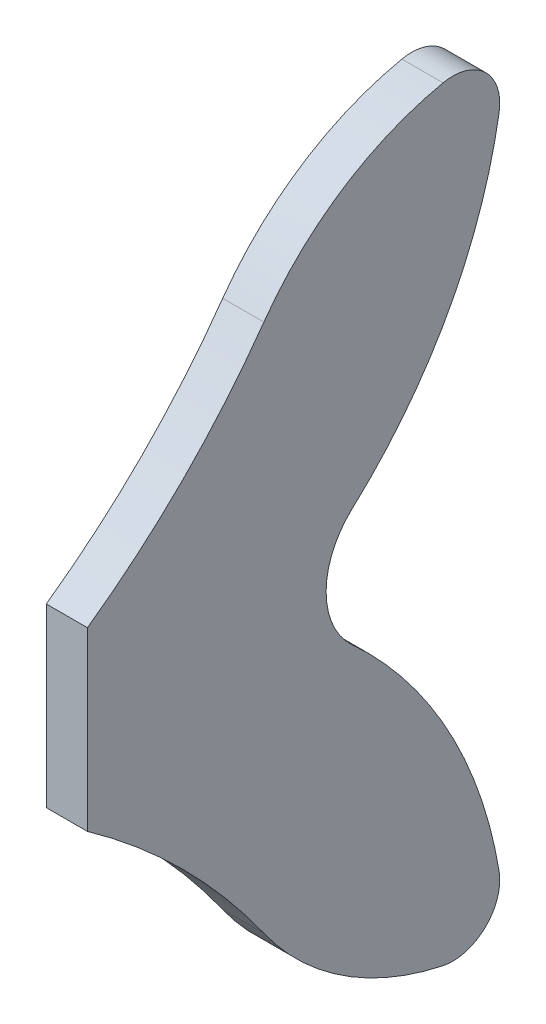
ISO-10303-21;
HEADER;
FILE_DESCRIPTION(('STEP AP214'),'2;1');
FILE_NAME('part.step','',(''),(''),'','','');
FILE_SCHEMA(('AUTOMOTIVE_DESIGN { 1 0 10303 214 1 1 1 1 }'));
ENDSEC;
DATA;
#1=APPLICATION_CONTEXT('core data for automotive mechanical design processes');
#2=APPLICATION_PROTOCOL_DEFINITION('international standard','automotive_design',2000,#1);
#3=PRODUCT_CONTEXT('',#1,'mechanical');
#4=PRODUCT('Part','Part','',(#3));
#5=PRODUCT_RELATED_PRODUCT_CATEGORY('part','',(#4));
#6=PRODUCT_DEFINITION_FORMATION('','',#4);
#7=PRODUCT_DEFINITION_CONTEXT('part definition',#1,'design');
#8=PRODUCT_DEFINITION('design','',#6,#7);
#9=PRODUCT_DEFINITION_SHAPE('','',#8);
#10=(LENGTH_UNIT() NAMED_UNIT(*) SI_UNIT(.MILLI.,.METRE.));
#11=(NAMED_UNIT(*) PLANE_ANGLE_UNIT() SI_UNIT($,.RADIAN.));
#12=(NAMED_UNIT(*) SI_UNIT($,.STERADIAN.) SOLID_ANGLE_UNIT());
#13=UNCERTAINTY_MEASURE_WITH_UNIT(LENGTH_MEASURE(1.E-05),#10,'distance_accuracy_value','');
#14=(GEOMETRIC_REPRESENTATION_CONTEXT(3) GLOBAL_UNCERTAINTY_ASSIGNED_CONTEXT((#13)) GLOBAL_UNIT_ASSIGNED_CONTEXT((#10,
#11,#12)) REPRESENTATION_CONTEXT('',''));
#15=CARTESIAN_POINT('',(0.,0.,0.));
#16=DIRECTION('',(0.,0.,1.));
#17=DIRECTION('',(1.,0.,0.));
#18=AXIS2_PLACEMENT_3D('',#15,#16,#17);
#19=CARTESIAN_POINT('',(3.5,118.128693685528,73.1286936855277));
#20=DIRECTION('',(-1.,0.,0.));
#21=DIRECTION('',(0.,0.,1.));
#22=AXIS2_PLACEMENT_3D('',#19,#20,#21);
#23=CYLINDRICAL_SURFACE('',#22,126.425208330598);
#24=CARTESIAN_POINT('',(-3.5,118.128693685528,73.1286936855277));
#25=DIRECTION('',(-1.,0.,0.));
#26=DIRECTION('',(0.,0.,-1.));
#27=AXIS2_PLACEMENT_3D('',#24,#25,#26);
#28=CIRCLE('',#27,126.425208330598);
#29=CARTESIAN_POINT('',(-3.5,45.,-30.));
#30=VERTEX_POINT('',#29);
#31=CARTESIAN_POINT('',(-3.5,15.,0.));
#32=VERTEX_POINT('',#31);
#33=EDGE_CURVE('E141',#30,#32,#28,.T.);
#34=ORIENTED_EDGE('',*,*,#33,.T.);
#35=DIRECTION('',(-1.,0.,0.));
#36=VECTOR('',#35,1.);
#37=CARTESIAN_POINT('',(3.5,15.,0.));
#38=LINE('',#37,#36);
#39=CARTESIAN_POINT('',(3.5,15.,0.));
#40=VERTEX_POINT('',#39);
#41=EDGE_CURVE('E11',#40,#32,#38,.T.);
#42=ORIENTED_EDGE('',*,*,#41,.F.);
#43=CARTESIAN_POINT('',(3.5,118.128693685528,73.1286936855277));
#44=DIRECTION('',(-1.,0.,0.));
#45=DIRECTION('',(0.,0.,-1.));
#46=AXIS2_PLACEMENT_3D('',#43,#44,#45);
#47=CIRCLE('',#46,126.425208330598);
#48=CARTESIAN_POINT('',(3.5,45.,-30.));
#49=VERTEX_POINT('',#48);
#50=EDGE_CURVE('E159',#49,#40,#47,.T.);
#51=ORIENTED_EDGE('',*,*,#50,.F.);
#52=DIRECTION('',(-1.,0.,0.));
#53=VECTOR('',#52,1.);
#54=CARTESIAN_POINT('',(3.5,45.,-30.));
#55=LINE('',#54,#53);
#56=EDGE_CURVE('E137',#49,#30,#55,.T.);
#57=ORIENTED_EDGE('',*,*,#56,.T.);
#58=EDGE_LOOP('',(#34,#42,#51,#57));
#59=FACE_BOUND('',#58,.T.);
#60=ADVANCED_FACE('F33',(#59),#23,.F.);
#61=CARTESIAN_POINT('',(3.5,15.,0.));
#62=DIRECTION('',(0.,0.,-1.));
#63=DIRECTION('',(-1.,0.,0.));
#64=AXIS2_PLACEMENT_3D('',#61,#62,#63);
#65=PLANE('',#64);
#66=DIRECTION('',(0.,-1.,0.));
#67=VECTOR('',#66,1.);
#68=CARTESIAN_POINT('',(-3.5,15.,0.));
#69=LINE('',#68,#67);
#70=CARTESIAN_POINT('',(-3.5,-15.,0.));
#71=VERTEX_POINT('',#70);
#72=EDGE_CURVE('E144',#32,#71,#69,.T.);
#73=ORIENTED_EDGE('',*,*,#72,.T.);
#74=DIRECTION('',(-1.,0.,0.));
#75=VECTOR('',#74,1.);
#76=CARTESIAN_POINT('',(3.5,-15.,0.));
#77=LINE('',#76,#75);
#78=CARTESIAN_POINT('',(3.5,-15.,0.));
#79=VERTEX_POINT('',#78);
#80=EDGE_CURVE('E41',#79,#71,#77,.T.);
#81=ORIENTED_EDGE('',*,*,#80,.F.);
#82=DIRECTION('',(0.,-1.,0.));
#83=VECTOR('',#82,1.);
#84=CARTESIAN_POINT('',(3.5,15.,0.));
#85=LINE('',#84,#83);
#86=EDGE_CURVE('E98',#40,#79,#85,.T.);
#87=ORIENTED_EDGE('',*,*,#86,.F.);
#88=ORIENTED_EDGE('',*,*,#41,.T.);
#89=EDGE_LOOP('',(#73,#81,#87,#88));
#90=FACE_BOUND('',#89,.T.);
#91=ADVANCED_FACE('F208',(#90),#65,.F.);
#92=CARTESIAN_POINT('',(3.5,-118.128693685528,73.1286936855277));
#93=DIRECTION('',(-1.,0.,0.));
#94=DIRECTION('',(0.,0.,1.));
#95=AXIS2_PLACEMENT_3D('',#92,#93,#94);
#96=CYLINDRICAL_SURFACE('',#95,126.425208330598);
#97=CARTESIAN_POINT('',(-3.5,-118.128693685528,73.1286936855277));
#98=DIRECTION('',(-1.,0.,0.));
#99=DIRECTION('',(0.,0.,1.));
#100=AXIS2_PLACEMENT_3D('',#97,#98,#99);
#101=CIRCLE('',#100,126.425208330598);
#102=CARTESIAN_POINT('',(-3.5,-45.,-30.));
#103=VERTEX_POINT('',#102);
#104=EDGE_CURVE('E146',#71,#103,#101,.T.);
#105=ORIENTED_EDGE('',*,*,#104,.T.);
#106=DIRECTION('',(-1.,0.,0.));
#107=VECTOR('',#106,1.);
#108=CARTESIAN_POINT('',(3.5,-45.,-30.));
#109=LINE('',#108,#107);
#110=CARTESIAN_POINT('',(3.5,-45.,-30.));
#111=VERTEX_POINT('',#110);
#112=EDGE_CURVE('E172',#111,#103,#109,.T.);
#113=ORIENTED_EDGE('',*,*,#112,.F.);
#114=CARTESIAN_POINT('',(3.5,-118.128693685528,73.1286936855277));
#115=DIRECTION('',(-1.,0.,0.));
#116=DIRECTION('',(0.,0.,1.));
#117=AXIS2_PLACEMENT_3D('',#114,#115,#116);
#118=CIRCLE('',#117,126.425208330598);
#119=EDGE_CURVE('E180',#79,#111,#118,.T.);
#120=ORIENTED_EDGE('',*,*,#119,.F.);
#121=ORIENTED_EDGE('',*,*,#80,.T.);
#122=EDGE_LOOP('',(#105,#113,#120,#121));
#123=FACE_BOUND('',#122,.T.);
#124=ADVANCED_FACE('F178',(#123),#96,.F.);
#125=CARTESIAN_POINT('',(3.5,-16.078278354781,-70.78644403569));
#126=DIRECTION('',(-1.,0.,0.));
#127=DIRECTION('',(0.,0.,1.));
#128=AXIS2_PLACEMENT_3D('',#125,#126,#127);
#129=CYLINDRICAL_SURFACE('',#128,50.);
#130=CARTESIAN_POINT('',(-3.5,-16.078278354781,-70.78644403569));
#131=DIRECTION('',(1.,0.,0.));
#132=DIRECTION('',(0.,0.,-1.));
#133=AXIS2_PLACEMENT_3D('',#130,#131,#132);
#134=CIRCLE('',#133,50.);
#135=CARTESIAN_POINT('',(-3.5,-65.,-60.4585618100006));
#136=VERTEX_POINT('',#135);
#137=EDGE_CURVE('E148',#103,#136,#134,.T.);
#138=ORIENTED_EDGE('',*,*,#137,.T.);
#139=DIRECTION('',(-1.,0.,0.));
#140=VECTOR('',#139,1.);
#141=CARTESIAN_POINT('',(3.5,-65.,-60.4585618100006));
#142=LINE('',#141,#140);
#143=CARTESIAN_POINT('',(3.5,-65.,-60.4585618100006));
#144=VERTEX_POINT('',#143);
#145=EDGE_CURVE('E169',#144,#136,#142,.T.);
#146=ORIENTED_EDGE('',*,*,#145,.F.);
#147=CARTESIAN_POINT('',(3.5,-16.078278354781,-70.78644403569));
#148=DIRECTION('',(1.,0.,0.));
#149=DIRECTION('',(0.,0.,-1.));
#150=AXIS2_PLACEMENT_3D('',#147,#148,#149);
#151=CIRCLE('',#150,50.);
#152=EDGE_CURVE('E198',#111,#144,#151,.T.);
#153=ORIENTED_EDGE('',*,*,#152,.F.);
#154=ORIENTED_EDGE('',*,*,#112,.T.);
#155=EDGE_LOOP('',(#138,#146,#153,#154));
#156=FACE_BOUND('',#155,.T.);
#157=ADVANCED_FACE('F189',(#156),#129,.T.);
#158=CARTESIAN_POINT('',(3.5,-57.172524536765,-62.1110229661109));
#159=DIRECTION('',(-1.,0.,0.));
#160=DIRECTION('',(0.,0.,1.));
#161=AXIS2_PLACEMENT_3D('',#158,#159,#160);
#162=CYLINDRICAL_SURFACE('',#161,8.);
#163=CARTESIAN_POINT('',(-3.5,-57.172524536765,-62.1110229661109));
#164=DIRECTION('',(1.,0.,0.));
#165=DIRECTION('',(0.,0.,-1.));
#166=AXIS2_PLACEMENT_3D('',#163,#164,#165);
#167=CIRCLE('',#166,8.);
#168=CARTESIAN_POINT('',(-3.5,-55.8443523495954,-70.));
#169=VERTEX_POINT('',#168);
#170=EDGE_CURVE('E150',#136,#169,#167,.T.);
#171=ORIENTED_EDGE('',*,*,#170,.T.);
#172=DIRECTION('',(-1.,0.,0.));
#173=VECTOR('',#172,1.);
#174=CARTESIAN_POINT('',(3.5,-55.8443523495954,-70.));
#175=LINE('',#174,#173);
#176=CARTESIAN_POINT('',(3.5,-55.8443523495954,-70.));
#177=VERTEX_POINT('',#176);
#178=EDGE_CURVE('E166',#177,#169,#175,.T.);
#179=ORIENTED_EDGE('',*,*,#178,.F.);
#180=CARTESIAN_POINT('',(3.5,-57.172524536765,-62.1110229661109));
#181=DIRECTION('',(1.,0.,0.));
#182=DIRECTION('',(0.,0.,-1.));
#183=AXIS2_PLACEMENT_3D('',#180,#181,#182);
#184=CIRCLE('',#183,8.);
#185=EDGE_CURVE('E195',#144,#177,#184,.T.);
#186=ORIENTED_EDGE('',*,*,#185,.F.);
#187=ORIENTED_EDGE('',*,*,#145,.T.);
#188=EDGE_LOOP('',(#171,#179,#186,#187));
#189=FACE_BOUND('',#188,.T.);
#190=ADVANCED_FACE('F193',(#189),#162,.T.);
#191=CARTESIAN_POINT('',(3.5,-69.126074221291,8.88977033889073));
#192=DIRECTION('',(-1.,0.,0.));
#193=DIRECTION('',(0.,0.,1.));
#194=AXIS2_PLACEMENT_3D('',#191,#192,#193);
#195=CYLINDRICAL_SURFACE('',#194,80.);
#196=CARTESIAN_POINT('',(-3.5,-69.126074221291,8.88977033889073));
#197=DIRECTION('',(1.,0.,0.));
#198=DIRECTION('',(0.,0.,-1.));
#199=AXIS2_PLACEMENT_3D('',#196,#197,#198);
#200=CIRCLE('',#199,80.);
#201=CARTESIAN_POINT('',(-3.5,-10.,-45.));
#202=VERTEX_POINT('',#201);
#203=EDGE_CURVE('E152',#169,#202,#200,.T.);
#204=ORIENTED_EDGE('',*,*,#203,.T.);
#205=DIRECTION('',(-1.,0.,0.));
#206=VECTOR('',#205,1.);
#207=CARTESIAN_POINT('',(3.5,-10.,-45.));
#208=LINE('',#207,#206);
#209=CARTESIAN_POINT('',(3.5,-10.,-45.));
#210=VERTEX_POINT('',#209);
#211=EDGE_CURVE('E163',#210,#202,#208,.T.);
#212=ORIENTED_EDGE('',*,*,#211,.F.);
#213=CARTESIAN_POINT('',(3.5,-69.126074221291,8.88977033889073));
#214=DIRECTION('',(1.,0.,0.));
#215=DIRECTION('',(0.,0.,-1.));
#216=AXIS2_PLACEMENT_3D('',#213,#214,#215);
#217=CIRCLE('',#216,80.);
#218=EDGE_CURVE('E197',#177,#210,#217,.T.);
#219=ORIENTED_EDGE('',*,*,#218,.F.);
#220=ORIENTED_EDGE('',*,*,#178,.T.);
#221=EDGE_LOOP('',(#204,#212,#219,#220));
#222=FACE_BOUND('',#221,.T.);
#223=ADVANCED_FACE('F220',(#222),#195,.T.);
#224=CARTESIAN_POINT('',(3.5,0.,-54.1143832985085));
#225=DIRECTION('',(-1.,0.,0.));
#226=DIRECTION('',(0.,0.,1.));
#227=AXIS2_PLACEMENT_3D('',#224,#225,#226);
#228=CYLINDRICAL_SURFACE('',#227,13.5304095618769);
#229=CARTESIAN_POINT('',(-3.5,0.,-54.1143832985085));
#230=DIRECTION('',(-1.,0.,0.));
#231=DIRECTION('',(0.,0.,-1.));
#232=AXIS2_PLACEMENT_3D('',#229,#230,#231);
#233=CIRCLE('',#232,13.5304095618769);
#234=CARTESIAN_POINT('',(-3.5,10.,-45.));
#235=VERTEX_POINT('',#234);
#236=EDGE_CURVE('E154',#202,#235,#233,.T.);
#237=ORIENTED_EDGE('',*,*,#236,.T.);
#238=DIRECTION('',(-1.,0.,0.));
#239=VECTOR('',#238,1.);
#240=CARTESIAN_POINT('',(3.5,10.,-45.));
#241=LINE('',#240,#239);
#242=CARTESIAN_POINT('',(3.5,10.,-45.));
#243=VERTEX_POINT('',#242);
#244=EDGE_CURVE('E132',#243,#235,#241,.T.);
#245=ORIENTED_EDGE('',*,*,#244,.F.);
#246=CARTESIAN_POINT('',(3.5,0.,-54.1143832985085));
#247=DIRECTION('',(-1.,0.,0.));
#248=DIRECTION('',(0.,0.,-1.));
#249=AXIS2_PLACEMENT_3D('',#246,#247,#248);
#250=CIRCLE('',#249,13.5304095618769);
#251=EDGE_CURVE('E123',#210,#243,#250,.T.);
#252=ORIENTED_EDGE('',*,*,#251,.F.);
#253=ORIENTED_EDGE('',*,*,#211,.T.);
#254=EDGE_LOOP('',(#237,#245,#252,#253));
#255=FACE_BOUND('',#254,.T.);
#256=ADVANCED_FACE('F223',(#255),#228,.F.);
#257=CARTESIAN_POINT('',(3.5,69.126074221291,8.88977033889073));
#258=DIRECTION('',(-1.,0.,0.));
#259=DIRECTION('',(0.,0.,1.));
#260=AXIS2_PLACEMENT_3D('',#257,#258,#259);
#261=CYLINDRICAL_SURFACE('',#260,80.);
#262=CARTESIAN_POINT('',(-3.5,69.126074221291,8.88977033889073));
#263=DIRECTION('',(1.,0.,0.));
#264=DIRECTION('',(0.,0.,1.));
#265=AXIS2_PLACEMENT_3D('',#262,#263,#264);
#266=CIRCLE('',#265,80.);
#267=CARTESIAN_POINT('',(-3.5,55.8443523495954,-70.));
#268=VERTEX_POINT('',#267);
#269=EDGE_CURVE('E131',#235,#268,#266,.T.);
#270=ORIENTED_EDGE('',*,*,#269,.T.);
#271=DIRECTION('',(-1.,0.,0.));
#272=VECTOR('',#271,1.);
#273=CARTESIAN_POINT('',(3.5,55.8443523495954,-70.));
#274=LINE('',#273,#272);
#275=CARTESIAN_POINT('',(3.5,55.8443523495954,-70.));
#276=VERTEX_POINT('',#275);
#277=EDGE_CURVE('E128',#276,#268,#274,.T.);
#278=ORIENTED_EDGE('',*,*,#277,.F.);
#279=CARTESIAN_POINT('',(3.5,69.126074221291,8.88977033889073));
#280=DIRECTION('',(1.,0.,0.));
#281=DIRECTION('',(0.,0.,1.));
#282=AXIS2_PLACEMENT_3D('',#279,#280,#281);
#283=CIRCLE('',#282,80.);
#284=EDGE_CURVE('E117',#243,#276,#283,.T.);
#285=ORIENTED_EDGE('',*,*,#284,.F.);
#286=ORIENTED_EDGE('',*,*,#244,.T.);
#287=EDGE_LOOP('',(#270,#278,#285,#286));
#288=FACE_BOUND('',#287,.T.);
#289=ADVANCED_FACE('F129',(#288),#261,.T.);
#290=CARTESIAN_POINT('',(3.5,57.172524536765,-62.1110229661109));
#291=DIRECTION('',(-1.,0.,0.));
#292=DIRECTION('',(0.,0.,1.));
#293=AXIS2_PLACEMENT_3D('',#290,#291,#292);
#294=CYLINDRICAL_SURFACE('',#293,8.);
#295=CARTESIAN_POINT('',(-3.5,57.172524536765,-62.1110229661109));
#296=DIRECTION('',(1.,0.,0.));
#297=DIRECTION('',(0.,0.,1.));
#298=AXIS2_PLACEMENT_3D('',#295,#296,#297);
#299=CIRCLE('',#298,8.);
#300=CARTESIAN_POINT('',(-3.5,65.,-60.4585618100006));
#301=VERTEX_POINT('',#300);
#302=EDGE_CURVE('E84',#268,#301,#299,.T.);
#303=ORIENTED_EDGE('',*,*,#302,.T.);
#304=DIRECTION('',(-1.,0.,0.));
#305=VECTOR('',#304,1.);
#306=CARTESIAN_POINT('',(3.5,65.,-60.4585618100006));
#307=LINE('',#306,#305);
#308=CARTESIAN_POINT('',(3.5,65.,-60.4585618100006));
#309=VERTEX_POINT('',#308);
#310=EDGE_CURVE('E133',#309,#301,#307,.T.);
#311=ORIENTED_EDGE('',*,*,#310,.F.);
#312=CARTESIAN_POINT('',(3.5,57.172524536765,-62.1110229661109));
#313=DIRECTION('',(1.,0.,0.));
#314=DIRECTION('',(0.,0.,1.));
#315=AXIS2_PLACEMENT_3D('',#312,#313,#314);
#316=CIRCLE('',#315,8.);
#317=EDGE_CURVE('E121',#276,#309,#316,.T.);
#318=ORIENTED_EDGE('',*,*,#317,.F.);
#319=ORIENTED_EDGE('',*,*,#277,.T.);
#320=EDGE_LOOP('',(#303,#311,#318,#319));
#321=FACE_BOUND('',#320,.T.);
#322=ADVANCED_FACE('F135',(#321),#294,.T.);
#323=CARTESIAN_POINT('',(3.5,16.078278354781,-70.78644403569));
#324=DIRECTION('',(-1.,0.,0.));
#325=DIRECTION('',(0.,0.,1.));
#326=AXIS2_PLACEMENT_3D('',#323,#324,#325);
#327=CYLINDRICAL_SURFACE('',#326,50.);
#328=CARTESIAN_POINT('',(-3.5,16.078278354781,-70.78644403569));
#329=DIRECTION('',(1.,0.,0.));
#330=DIRECTION('',(0.,0.,1.));
#331=AXIS2_PLACEMENT_3D('',#328,#329,#330);
#332=CIRCLE('',#331,50.);
#333=EDGE_CURVE('E90',#301,#30,#332,.T.);
#334=ORIENTED_EDGE('',*,*,#333,.T.);
#335=ORIENTED_EDGE('',*,*,#56,.F.);
#336=CARTESIAN_POINT('',(3.5,16.078278354781,-70.78644403569));
#337=DIRECTION('',(1.,0.,0.));
#338=DIRECTION('',(0.,0.,1.));
#339=AXIS2_PLACEMENT_3D('',#336,#337,#338);
#340=CIRCLE('',#339,50.);
#341=EDGE_CURVE('E49',#309,#49,#340,.T.);
#342=ORIENTED_EDGE('',*,*,#341,.F.);
#343=ORIENTED_EDGE('',*,*,#310,.T.);
#344=EDGE_LOOP('',(#334,#335,#342,#343));
#345=FACE_BOUND('',#344,.T.);
#346=ADVANCED_FACE('F232',(#345),#327,.T.);
#347=CARTESIAN_POINT('',(3.5,118.128693685528,73.1286936855277));
#348=DIRECTION('',(1.,0.,0.));
#349=DIRECTION('',(0.,0.,-1.));
#350=AXIS2_PLACEMENT_3D('',#347,#348,#349);
#351=PLANE('',#350);
#352=ORIENTED_EDGE('',*,*,#50,.T.);
#353=ORIENTED_EDGE('',*,*,#86,.T.);
#354=ORIENTED_EDGE('',*,*,#119,.T.);
#355=ORIENTED_EDGE('',*,*,#152,.T.);
#356=ORIENTED_EDGE('',*,*,#185,.T.);
#357=ORIENTED_EDGE('',*,*,#218,.T.);
#358=ORIENTED_EDGE('',*,*,#251,.T.);
#359=ORIENTED_EDGE('',*,*,#284,.T.);
#360=ORIENTED_EDGE('',*,*,#317,.T.);
#361=ORIENTED_EDGE('',*,*,#341,.T.);
#362=EDGE_LOOP('',(#352,#353,#354,#355,#356,#357,#358,#359,#360,#361));
#363=FACE_BOUND('',#362,.T.);
#364=ADVANCED_FACE('F119',(#363),#351,.T.);
#365=CARTESIAN_POINT('',(-3.5,118.128693685528,73.1286936855277));
#366=DIRECTION('',(1.,0.,0.));
#367=DIRECTION('',(0.,0.,-1.));
#368=AXIS2_PLACEMENT_3D('',#365,#366,#367);
#369=PLANE('',#368);
#370=ORIENTED_EDGE('',*,*,#33,.F.);
#371=ORIENTED_EDGE('',*,*,#333,.F.);
#372=ORIENTED_EDGE('',*,*,#302,.F.);
#373=ORIENTED_EDGE('',*,*,#269,.F.);
#374=ORIENTED_EDGE('',*,*,#236,.F.);
#375=ORIENTED_EDGE('',*,*,#203,.F.);
#376=ORIENTED_EDGE('',*,*,#170,.F.);
#377=ORIENTED_EDGE('',*,*,#137,.F.);
#378=ORIENTED_EDGE('',*,*,#104,.F.);
#379=ORIENTED_EDGE('',*,*,#72,.F.);
#380=EDGE_LOOP('',(#370,#371,#372,#373,#374,#375,#376,#377,#378,#379));
#381=FACE_BOUND('',#380,.T.);
#382=ADVANCED_FACE('F184',(#381),#369,.F.);
#383=CLOSED_SHELL('',(#60,#91,#124,#157,#190,#223,#256,#289,#322,#346,#364,#382));
#384=MANIFOLD_SOLID_BREP('B2',#383);
#385=ADVANCED_BREP_SHAPE_REPRESENTATION('',(#18,#384),#14);
#386=SHAPE_DEFINITION_REPRESENTATION(#9,#385);
ENDSEC;
END-ISO-10303-21;
